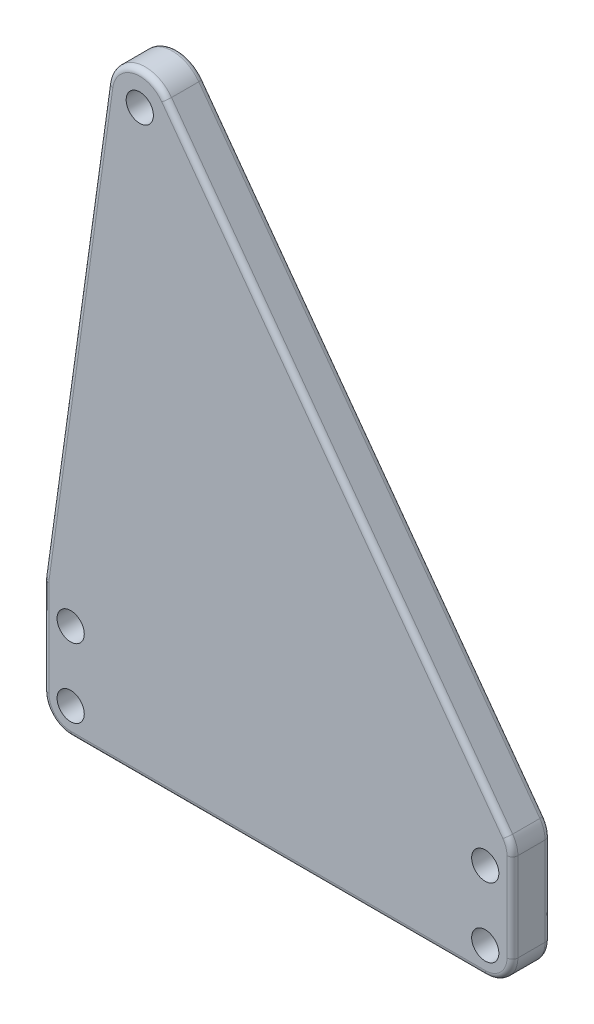
ISO-10303-21;
HEADER;
FILE_DESCRIPTION(('STEP AP214'),'2;1');
FILE_NAME('part.step','',(''),(''),'','','');
FILE_SCHEMA(('AUTOMOTIVE_DESIGN { 1 0 10303 214 1 1 1 1 }'));
ENDSEC;
DATA;
#1=APPLICATION_CONTEXT('core data for automotive mechanical design processes');
#2=APPLICATION_PROTOCOL_DEFINITION('international standard','automotive_design',2000,#1);
#3=PRODUCT_CONTEXT('',#1,'mechanical');
#4=PRODUCT('Part','Part','',(#3));
#5=PRODUCT_RELATED_PRODUCT_CATEGORY('part','',(#4));
#6=PRODUCT_DEFINITION_FORMATION('','',#4);
#7=PRODUCT_DEFINITION_CONTEXT('part definition',#1,'design');
#8=PRODUCT_DEFINITION('design','',#6,#7);
#9=PRODUCT_DEFINITION_SHAPE('','',#8);
#10=(LENGTH_UNIT() NAMED_UNIT(*) SI_UNIT(.MILLI.,.METRE.));
#11=(NAMED_UNIT(*) PLANE_ANGLE_UNIT() SI_UNIT($,.RADIAN.));
#12=(NAMED_UNIT(*) SI_UNIT($,.STERADIAN.) SOLID_ANGLE_UNIT());
#13=UNCERTAINTY_MEASURE_WITH_UNIT(LENGTH_MEASURE(1.E-05),#10,'distance_accuracy_value','');
#14=(GEOMETRIC_REPRESENTATION_CONTEXT(3) GLOBAL_UNCERTAINTY_ASSIGNED_CONTEXT((#13)) GLOBAL_UNIT_ASSIGNED_CONTEXT((#10,
#11,#12)) REPRESENTATION_CONTEXT('',''));
#15=CARTESIAN_POINT('',(0.,0.,0.));
#16=DIRECTION('',(0.,0.,1.));
#17=DIRECTION('',(1.,0.,0.));
#18=AXIS2_PLACEMENT_3D('',#15,#16,#17);
#19=CARTESIAN_POINT('',(4.84674686973694,3.5368127997811,7.));
#20=DIRECTION('',(-0.807791144956154,-0.589468799963515,0.));
#21=DIRECTION('',(0.589468799963515,-0.807791144956154,0.));
#22=AXIS2_PLACEMENT_3D('',#19,#20,#21);
#23=PLANE('',#22);
#24=DIRECTION('',(0.,0.,-1.));
#25=VECTOR('',#24,1.);
#26=CARTESIAN_POINT('',(67.5389557247808,-82.3747929950984,0.));
#27=LINE('',#26,#25);
#28=CARTESIAN_POINT('',(67.5389557247808,-82.3747929950984,6.));
#29=VERTEX_POINT('',#28);
#30=CARTESIAN_POINT('',(67.5389557247808,-82.3747929950984,1.));
#31=VERTEX_POINT('',#30);
#32=EDGE_CURVE('E399',#29,#31,#27,.T.);
#33=ORIENTED_EDGE('',*,*,#32,.T.);
#34=DIRECTION('',(-0.589468799963515,0.807791144956154,0.));
#35=VECTOR('',#34,1.);
#36=CARTESIAN_POINT('',(4.84674686973694,3.5368127997811,1.));
#37=LINE('',#36,#35);
#38=CARTESIAN_POINT('',(4.84674686973693,3.5368127997811,1.));
#39=VERTEX_POINT('',#38);
#40=EDGE_CURVE('E265',#31,#39,#37,.T.);
#41=ORIENTED_EDGE('',*,*,#40,.T.);
#42=DIRECTION('',(0.,0.,-1.));
#43=VECTOR('',#42,1.);
#44=CARTESIAN_POINT('',(4.84674686973693,3.5368127997811,7.));
#45=LINE('',#44,#43);
#46=CARTESIAN_POINT('',(4.84674686973693,3.5368127997811,6.));
#47=VERTEX_POINT('',#46);
#48=EDGE_CURVE('E459',#47,#39,#45,.T.);
#49=ORIENTED_EDGE('',*,*,#48,.F.);
#50=DIRECTION('',(-0.589468799963515,0.807791144956154,0.));
#51=VECTOR('',#50,1.);
#52=CARTESIAN_POINT('',(67.5389557247808,-82.3747929950984,6.));
#53=LINE('',#52,#51);
#54=EDGE_CURVE('E262',#47,#29,#53,.F.);
#55=ORIENTED_EDGE('',*,*,#54,.T.);
#56=EDGE_LOOP('',(#33,#41,#49,#55));
#57=FACE_BOUND('',#56,.T.);
#58=ADVANCED_FACE('F43',(#57),#23,.F.);
#59=CARTESIAN_POINT('',(0.,0.,7.));
#60=DIRECTION('',(0.,0.,-1.));
#61=DIRECTION('',(-1.,0.,0.));
#62=AXIS2_PLACEMENT_3D('',#59,#60,#61);
#63=CYLINDRICAL_SURFACE('',#62,6.);
#64=ORIENTED_EDGE('',*,*,#48,.T.);
#65=CARTESIAN_POINT('',(0.,0.,1.));
#66=DIRECTION('',(0.,0.,1.));
#67=DIRECTION('',(1.,0.,0.));
#68=AXIS2_PLACEMENT_3D('',#65,#66,#67);
#69=CIRCLE('',#68,6.);
#70=CARTESIAN_POINT('',(-5.94277579639863,0.826689684064445,1.));
#71=VERTEX_POINT('',#70);
#72=EDGE_CURVE('E271',#39,#71,#69,.T.);
#73=ORIENTED_EDGE('',*,*,#72,.T.);
#74=DIRECTION('',(0.,0.,-1.));
#75=VECTOR('',#74,1.);
#76=CARTESIAN_POINT('',(-5.94277579639863,0.826689684064445,7.));
#77=LINE('',#76,#75);
#78=CARTESIAN_POINT('',(-5.94277579639863,0.826689684064445,6.));
#79=VERTEX_POINT('',#78);
#80=EDGE_CURVE('E465',#79,#71,#77,.T.);
#81=ORIENTED_EDGE('',*,*,#80,.F.);
#82=CARTESIAN_POINT('',(0.,0.,6.));
#83=DIRECTION('',(0.,0.,1.));
#84=DIRECTION('',(1.,0.,0.));
#85=AXIS2_PLACEMENT_3D('',#82,#83,#84);
#86=CIRCLE('',#85,6.);
#87=EDGE_CURVE('E268',#79,#47,#86,.F.);
#88=ORIENTED_EDGE('',*,*,#87,.T.);
#89=EDGE_LOOP('',(#64,#73,#81,#88));
#90=FACE_BOUND('',#89,.T.);
#91=ADVANCED_FACE('F538',(#90),#63,.T.);
#92=CARTESIAN_POINT('',(-5.94277579639863,0.826689684064445,7.));
#93=DIRECTION('',(-0.990462632733106,0.137781614010741,0.));
#94=DIRECTION('',(-0.137781614010741,-0.990462632733106,0.));
#95=AXIS2_PLACEMENT_3D('',#92,#93,#94);
#96=PLANE('',#95);
#97=ORIENTED_EDGE('',*,*,#80,.T.);
#98=DIRECTION('',(0.137781614010741,0.990462632733106,0.));
#99=VECTOR('',#98,1.);
#100=CARTESIAN_POINT('',(-17.6523131636655,-83.3489769470851,1.));
#101=LINE('',#100,#99);
#102=CARTESIAN_POINT('',(-17.6523131636655,-83.3489769470851,1.));
#103=VERTEX_POINT('',#102);
#104=EDGE_CURVE('E11',#71,#103,#101,.F.);
#105=ORIENTED_EDGE('',*,*,#104,.T.);
#106=DIRECTION('',(0.,0.,-1.));
#107=VECTOR('',#106,1.);
#108=CARTESIAN_POINT('',(-17.6523131636655,-83.3489769470851,7.));
#109=LINE('',#108,#107);
#110=CARTESIAN_POINT('',(-17.6523131636655,-83.3489769470851,6.));
#111=VERTEX_POINT('',#110);
#112=EDGE_CURVE('E406',#103,#111,#109,.F.);
#113=ORIENTED_EDGE('',*,*,#112,.T.);
#114=DIRECTION('',(0.137781614010741,0.990462632733106,0.));
#115=VECTOR('',#114,1.);
#116=CARTESIAN_POINT('',(-5.94277579639863,0.826689684064445,6.));
#117=LINE('',#116,#115);
#118=EDGE_CURVE('E53',#111,#79,#117,.T.);
#119=ORIENTED_EDGE('',*,*,#118,.T.);
#120=EDGE_LOOP('',(#97,#105,#113,#119));
#121=FACE_BOUND('',#120,.T.);
#122=ADVANCED_FACE('F544',(#121),#96,.T.);
#123=CARTESIAN_POINT('',(-17.7,0.,7.));
#124=DIRECTION('',(1.,0.,0.));
#125=DIRECTION('',(0.,1.,0.));
#126=AXIS2_PLACEMENT_3D('',#123,#124,#125);
#127=PLANE('',#126);
#128=DIRECTION('',(0.,0.,-1.));
#129=VECTOR('',#128,1.);
#130=CARTESIAN_POINT('',(-17.7,-84.0378850171388,0.));
#131=LINE('',#130,#129);
#132=CARTESIAN_POINT('',(-17.7,-84.0378850171388,6.));
#133=VERTEX_POINT('',#132);
#134=CARTESIAN_POINT('',(-17.7,-84.0378850171388,1.));
#135=VERTEX_POINT('',#134);
#136=EDGE_CURVE('E450',#133,#135,#131,.T.);
#137=ORIENTED_EDGE('',*,*,#136,.T.);
#138=DIRECTION('',(0.,-1.,0.));
#139=VECTOR('',#138,1.);
#140=CARTESIAN_POINT('',(-17.7,0.,1.));
#141=LINE('',#140,#139);
#142=CARTESIAN_POINT('',(-17.7,-101.6,1.));
#143=VERTEX_POINT('',#142);
#144=EDGE_CURVE('E229',#135,#143,#141,.T.);
#145=ORIENTED_EDGE('',*,*,#144,.T.);
#146=DIRECTION('',(0.,0.,-1.));
#147=VECTOR('',#146,1.);
#148=CARTESIAN_POINT('',(-17.7,-101.6,7.));
#149=LINE('',#148,#147);
#150=CARTESIAN_POINT('',(-17.7,-101.6,6.));
#151=VERTEX_POINT('',#150);
#152=EDGE_CURVE('E455',#143,#151,#149,.F.);
#153=ORIENTED_EDGE('',*,*,#152,.T.);
#154=DIRECTION('',(0.,-1.,0.));
#155=VECTOR('',#154,1.);
#156=CARTESIAN_POINT('',(-17.7,-84.0378850171388,6.));
#157=LINE('',#156,#155);
#158=EDGE_CURVE('E226',#151,#133,#157,.F.);
#159=ORIENTED_EDGE('',*,*,#158,.T.);
#160=EDGE_LOOP('',(#137,#145,#153,#159));
#161=FACE_BOUND('',#160,.T.);
#162=ADVANCED_FACE('F452',(#161),#127,.F.);
#163=CARTESIAN_POINT('',(0.,-106.6,7.));
#164=DIRECTION('',(0.,1.,0.));
#165=DIRECTION('',(0.,0.,1.));
#166=AXIS2_PLACEMENT_3D('',#163,#164,#165);
#167=PLANE('',#166);
#168=DIRECTION('',(0.,0.,-1.));
#169=VECTOR('',#168,1.);
#170=CARTESIAN_POINT('',(-12.7,-106.6,7.));
#171=LINE('',#170,#169);
#172=CARTESIAN_POINT('',(-12.7,-106.6,6.));
#173=VERTEX_POINT('',#172);
#174=CARTESIAN_POINT('',(-12.7,-106.6,1.));
#175=VERTEX_POINT('',#174);
#176=EDGE_CURVE('E403',#173,#175,#171,.T.);
#177=ORIENTED_EDGE('',*,*,#176,.T.);
#178=DIRECTION('',(1.,0.,0.));
#179=VECTOR('',#178,1.);
#180=CARTESIAN_POINT('',(0.,-106.6,1.));
#181=LINE('',#180,#179);
#182=CARTESIAN_POINT('',(63.5,-106.6,1.));
#183=VERTEX_POINT('',#182);
#184=EDGE_CURVE('E241',#175,#183,#181,.T.);
#185=ORIENTED_EDGE('',*,*,#184,.T.);
#186=DIRECTION('',(0.,0.,-1.));
#187=VECTOR('',#186,1.);
#188=CARTESIAN_POINT('',(63.5,-106.6,7.));
#189=LINE('',#188,#187);
#190=CARTESIAN_POINT('',(63.5,-106.6,6.));
#191=VERTEX_POINT('',#190);
#192=EDGE_CURVE('E206',#183,#191,#189,.F.);
#193=ORIENTED_EDGE('',*,*,#192,.T.);
#194=DIRECTION('',(1.,0.,0.));
#195=VECTOR('',#194,1.);
#196=CARTESIAN_POINT('',(-12.7,-106.6,6.));
#197=LINE('',#196,#195);
#198=EDGE_CURVE('E238',#191,#173,#197,.F.);
#199=ORIENTED_EDGE('',*,*,#198,.T.);
#200=EDGE_LOOP('',(#177,#185,#193,#199));
#201=FACE_BOUND('',#200,.T.);
#202=ADVANCED_FACE('F709',(#201),#167,.F.);
#203=CARTESIAN_POINT('',(-12.7,-88.9,7.));
#204=DIRECTION('',(0.,0.,-1.));
#205=DIRECTION('',(-1.,0.,0.));
#206=AXIS2_PLACEMENT_3D('',#203,#204,#205);
#207=CYLINDRICAL_SURFACE('',#206,2.5);
#208=CARTESIAN_POINT('',(-12.7,-88.9,7.));
#209=DIRECTION('',(0.,0.,1.));
#210=DIRECTION('',(1.,0.,0.));
#211=AXIS2_PLACEMENT_3D('',#208,#209,#210);
#212=CIRCLE('',#211,2.5);
#213=CARTESIAN_POINT('',(-10.2,-88.9,7.));
#214=VERTEX_POINT('',#213);
#215=EDGE_CURVE('E493',#214,#214,#212,.T.);
#216=ORIENTED_EDGE('',*,*,#215,.T.);
#217=EDGE_LOOP('',(#216));
#218=FACE_BOUND('',#217,.T.);
#219=CARTESIAN_POINT('',(-12.7,-88.9,0.));
#220=DIRECTION('',(0.,0.,1.));
#221=DIRECTION('',(1.,0.,0.));
#222=AXIS2_PLACEMENT_3D('',#219,#220,#221);
#223=CIRCLE('',#222,2.5);
#224=CARTESIAN_POINT('',(-10.2,-88.9,0.));
#225=VERTEX_POINT('',#224);
#226=EDGE_CURVE('E475',#225,#225,#223,.T.);
#227=ORIENTED_EDGE('',*,*,#226,.F.);
#228=EDGE_LOOP('',(#227));
#229=FACE_BOUND('',#228,.T.);
#230=ADVANCED_FACE('F714',(#218,#229),#207,.F.);
#231=CARTESIAN_POINT('',(-12.7,-101.6,7.));
#232=DIRECTION('',(0.,0.,-1.));
#233=DIRECTION('',(-1.,0.,0.));
#234=AXIS2_PLACEMENT_3D('',#231,#232,#233);
#235=CYLINDRICAL_SURFACE('',#234,2.5);
#236=CARTESIAN_POINT('',(-12.7,-101.6,7.));
#237=DIRECTION('',(0.,0.,1.));
#238=DIRECTION('',(1.,0.,0.));
#239=AXIS2_PLACEMENT_3D('',#236,#237,#238);
#240=CIRCLE('',#239,2.5);
#241=CARTESIAN_POINT('',(-10.2,-101.6,7.));
#242=VERTEX_POINT('',#241);
#243=EDGE_CURVE('E497',#242,#242,#240,.T.);
#244=ORIENTED_EDGE('',*,*,#243,.T.);
#245=EDGE_LOOP('',(#244));
#246=FACE_BOUND('',#245,.T.);
#247=CARTESIAN_POINT('',(-12.7,-101.6,0.));
#248=DIRECTION('',(0.,0.,1.));
#249=DIRECTION('',(1.,0.,0.));
#250=AXIS2_PLACEMENT_3D('',#247,#248,#249);
#251=CIRCLE('',#250,2.5);
#252=CARTESIAN_POINT('',(-10.2,-101.6,0.));
#253=VERTEX_POINT('',#252);
#254=EDGE_CURVE('E479',#253,#253,#251,.T.);
#255=ORIENTED_EDGE('',*,*,#254,.F.);
#256=EDGE_LOOP('',(#255));
#257=FACE_BOUND('',#256,.T.);
#258=ADVANCED_FACE('F764',(#246,#257),#235,.F.);
#259=CARTESIAN_POINT('',(63.5,-88.9,7.));
#260=DIRECTION('',(0.,0.,-1.));
#261=DIRECTION('',(-1.,0.,0.));
#262=AXIS2_PLACEMENT_3D('',#259,#260,#261);
#263=CYLINDRICAL_SURFACE('',#262,2.50000000000001);
#264=CARTESIAN_POINT('',(63.5,-88.9,7.));
#265=DIRECTION('',(0.,0.,1.));
#266=DIRECTION('',(1.,0.,0.));
#267=AXIS2_PLACEMENT_3D('',#264,#265,#266);
#268=CIRCLE('',#267,2.50000000000001);
#269=CARTESIAN_POINT('',(66.,-88.9,7.));
#270=VERTEX_POINT('',#269);
#271=EDGE_CURVE('E501',#270,#270,#268,.T.);
#272=ORIENTED_EDGE('',*,*,#271,.T.);
#273=EDGE_LOOP('',(#272));
#274=FACE_BOUND('',#273,.T.);
#275=CARTESIAN_POINT('',(63.5,-88.9,0.));
#276=DIRECTION('',(0.,0.,1.));
#277=DIRECTION('',(1.,0.,0.));
#278=AXIS2_PLACEMENT_3D('',#275,#276,#277);
#279=CIRCLE('',#278,2.50000000000001);
#280=CARTESIAN_POINT('',(66.,-88.9,0.));
#281=VERTEX_POINT('',#280);
#282=EDGE_CURVE('E483',#281,#281,#279,.T.);
#283=ORIENTED_EDGE('',*,*,#282,.F.);
#284=EDGE_LOOP('',(#283));
#285=FACE_BOUND('',#284,.T.);
#286=ADVANCED_FACE('F755',(#274,#285),#263,.F.);
#287=CARTESIAN_POINT('',(63.5,-101.6,7.));
#288=DIRECTION('',(0.,0.,-1.));
#289=DIRECTION('',(-1.,0.,0.));
#290=AXIS2_PLACEMENT_3D('',#287,#288,#289);
#291=CYLINDRICAL_SURFACE('',#290,2.50000000000001);
#292=CARTESIAN_POINT('',(63.5,-101.6,7.));
#293=DIRECTION('',(0.,0.,1.));
#294=DIRECTION('',(1.,0.,0.));
#295=AXIS2_PLACEMENT_3D('',#292,#293,#294);
#296=CIRCLE('',#295,2.50000000000001);
#297=CARTESIAN_POINT('',(66.,-101.6,7.));
#298=VERTEX_POINT('',#297);
#299=EDGE_CURVE('E474',#298,#298,#296,.T.);
#300=ORIENTED_EDGE('',*,*,#299,.T.);
#301=EDGE_LOOP('',(#300));
#302=FACE_BOUND('',#301,.T.);
#303=CARTESIAN_POINT('',(63.5,-101.6,0.));
#304=DIRECTION('',(0.,0.,1.));
#305=DIRECTION('',(1.,0.,0.));
#306=AXIS2_PLACEMENT_3D('',#303,#304,#305);
#307=CIRCLE('',#306,2.50000000000001);
#308=CARTESIAN_POINT('',(66.,-101.6,0.));
#309=VERTEX_POINT('',#308);
#310=EDGE_CURVE('E337',#309,#309,#307,.T.);
#311=ORIENTED_EDGE('',*,*,#310,.F.);
#312=EDGE_LOOP('',(#311));
#313=FACE_BOUND('',#312,.T.);
#314=ADVANCED_FACE('F509',(#302,#313),#291,.F.);
#315=CARTESIAN_POINT('',(68.5,0.,7.));
#316=DIRECTION('',(1.,0.,0.));
#317=DIRECTION('',(0.,0.,-1.));
#318=AXIS2_PLACEMENT_3D('',#315,#316,#317);
#319=PLANE('',#318);
#320=DIRECTION('',(0.,0.,-1.));
#321=VECTOR('',#320,1.);
#322=CARTESIAN_POINT('',(68.5,-101.6,0.));
#323=LINE('',#322,#321);
#324=CARTESIAN_POINT('',(68.5,-101.6,6.));
#325=VERTEX_POINT('',#324);
#326=CARTESIAN_POINT('',(68.5,-101.6,1.));
#327=VERTEX_POINT('',#326);
#328=EDGE_CURVE('E389',#325,#327,#323,.T.);
#329=ORIENTED_EDGE('',*,*,#328,.T.);
#330=DIRECTION('',(0.,-1.,0.));
#331=VECTOR('',#330,1.);
#332=CARTESIAN_POINT('',(68.5,-85.322136994916,1.));
#333=LINE('',#332,#331);
#334=CARTESIAN_POINT('',(68.5,-85.322136994916,1.));
#335=VERTEX_POINT('',#334);
#336=EDGE_CURVE('E253',#327,#335,#333,.F.);
#337=ORIENTED_EDGE('',*,*,#336,.T.);
#338=DIRECTION('',(0.,0.,-1.));
#339=VECTOR('',#338,1.);
#340=CARTESIAN_POINT('',(68.5,-85.322136994916,7.));
#341=LINE('',#340,#339);
#342=CARTESIAN_POINT('',(68.5,-85.322136994916,6.));
#343=VERTEX_POINT('',#342);
#344=EDGE_CURVE('E392',#335,#343,#341,.F.);
#345=ORIENTED_EDGE('',*,*,#344,.T.);
#346=DIRECTION('',(0.,-1.,0.));
#347=VECTOR('',#346,1.);
#348=CARTESIAN_POINT('',(68.5,0.,6.));
#349=LINE('',#348,#347);
#350=EDGE_CURVE('E250',#343,#325,#349,.T.);
#351=ORIENTED_EDGE('',*,*,#350,.T.);
#352=EDGE_LOOP('',(#329,#337,#345,#351));
#353=FACE_BOUND('',#352,.T.);
#354=ADVANCED_FACE('F388',(#353),#319,.T.);
#355=CARTESIAN_POINT('',(0.,0.,7.));
#356=DIRECTION('',(0.,0.,-1.));
#357=DIRECTION('',(-1.,0.,0.));
#358=AXIS2_PLACEMENT_3D('',#355,#356,#357);
#359=CYLINDRICAL_SURFACE('',#358,2.5);
#360=CARTESIAN_POINT('',(0.,0.,7.));
#361=DIRECTION('',(0.,0.,1.));
#362=DIRECTION('',(1.,0.,0.));
#363=AXIS2_PLACEMENT_3D('',#360,#361,#362);
#364=CIRCLE('',#363,2.5);
#365=CARTESIAN_POINT('',(2.5,0.,7.));
#366=VERTEX_POINT('',#365);
#367=EDGE_CURVE('E469',#366,#366,#364,.T.);
#368=ORIENTED_EDGE('',*,*,#367,.T.);
#369=EDGE_LOOP('',(#368));
#370=FACE_BOUND('',#369,.T.);
#371=CARTESIAN_POINT('',(0.,0.,0.));
#372=DIRECTION('',(0.,0.,1.));
#373=DIRECTION('',(1.,0.,0.));
#374=AXIS2_PLACEMENT_3D('',#371,#372,#373);
#375=CIRCLE('',#374,2.5);
#376=CARTESIAN_POINT('',(2.5,0.,0.));
#377=VERTEX_POINT('',#376);
#378=EDGE_CURVE('E470',#377,#377,#375,.T.);
#379=ORIENTED_EDGE('',*,*,#378,.F.);
#380=EDGE_LOOP('',(#379));
#381=FACE_BOUND('',#380,.T.);
#382=ADVANCED_FACE('F515',(#370,#381),#359,.F.);
#383=CARTESIAN_POINT('',(0.,0.,7.));
#384=DIRECTION('',(0.,0.,1.));
#385=DIRECTION('',(1.,0.,0.));
#386=AXIS2_PLACEMENT_3D('',#383,#384,#385);
#387=PLANE('',#386);
#388=DIRECTION('',(0.137781614010741,0.990462632733106,0.));
#389=VECTOR('',#388,1.);
#390=CARTESIAN_POINT('',(-4.95231316366553,0.688908070053704,7.));
#391=LINE('',#390,#389);
#392=CARTESIAN_POINT('',(-4.95231316366553,0.688908070053704,7.));
#393=VERTEX_POINT('',#392);
#394=CARTESIAN_POINT('',(-16.6618505309324,-83.4867585610958,7.));
#395=VERTEX_POINT('',#394);
#396=EDGE_CURVE('E274',#393,#395,#391,.F.);
#397=ORIENTED_EDGE('',*,*,#396,.T.);
#398=CARTESIAN_POINT('',(-12.7,-84.0378850171388,7.));
#399=DIRECTION('',(0.,0.,1.));
#400=DIRECTION('',(1.,0.,0.));
#401=AXIS2_PLACEMENT_3D('',#398,#399,#400);
#402=CIRCLE('',#401,4.);
#403=CARTESIAN_POINT('',(-16.7,-84.0378850171388,7.));
#404=VERTEX_POINT('',#403);
#405=EDGE_CURVE('E300',#395,#404,#402,.T.);
#406=ORIENTED_EDGE('',*,*,#405,.T.);
#407=DIRECTION('',(0.,-1.,0.));
#408=VECTOR('',#407,1.);
#409=CARTESIAN_POINT('',(-16.7,-101.6,7.));
#410=LINE('',#409,#408);
#411=CARTESIAN_POINT('',(-16.7,-101.6,7.));
#412=VERTEX_POINT('',#411);
#413=EDGE_CURVE('E68',#404,#412,#410,.T.);
#414=ORIENTED_EDGE('',*,*,#413,.T.);
#415=CARTESIAN_POINT('',(-12.7,-101.6,7.));
#416=DIRECTION('',(0.,0.,1.));
#417=DIRECTION('',(1.,0.,0.));
#418=AXIS2_PLACEMENT_3D('',#415,#416,#417);
#419=CIRCLE('',#418,4.);
#420=CARTESIAN_POINT('',(-12.7,-105.6,7.));
#421=VERTEX_POINT('',#420);
#422=EDGE_CURVE('E295',#412,#421,#419,.T.);
#423=ORIENTED_EDGE('',*,*,#422,.T.);
#424=DIRECTION('',(1.,0.,0.));
#425=VECTOR('',#424,1.);
#426=CARTESIAN_POINT('',(63.5,-105.6,7.));
#427=LINE('',#426,#425);
#428=CARTESIAN_POINT('',(63.5,-105.6,7.));
#429=VERTEX_POINT('',#428);
#430=EDGE_CURVE('E292',#421,#429,#427,.T.);
#431=ORIENTED_EDGE('',*,*,#430,.T.);
#432=CARTESIAN_POINT('',(63.5,-101.6,7.));
#433=DIRECTION('',(0.,0.,1.));
#434=DIRECTION('',(1.,0.,0.));
#435=AXIS2_PLACEMENT_3D('',#432,#433,#434);
#436=CIRCLE('',#435,4.);
#437=CARTESIAN_POINT('',(67.5,-101.6,7.));
#438=VERTEX_POINT('',#437);
#439=EDGE_CURVE('E289',#429,#438,#436,.T.);
#440=ORIENTED_EDGE('',*,*,#439,.T.);
#441=DIRECTION('',(0.,-1.,0.));
#442=VECTOR('',#441,1.);
#443=CARTESIAN_POINT('',(67.5,0.,7.));
#444=LINE('',#443,#442);
#445=CARTESIAN_POINT('',(67.5,-85.322136994916,7.));
#446=VERTEX_POINT('',#445);
#447=EDGE_CURVE('E286',#438,#446,#444,.F.);
#448=ORIENTED_EDGE('',*,*,#447,.T.);
#449=CARTESIAN_POINT('',(63.5,-85.322136994916,7.));
#450=DIRECTION('',(0.,0.,1.));
#451=DIRECTION('',(1.,0.,0.));
#452=AXIS2_PLACEMENT_3D('',#449,#450,#451);
#453=CIRCLE('',#452,4.);
#454=CARTESIAN_POINT('',(66.7311645798246,-82.9642617950619,7.));
#455=VERTEX_POINT('',#454);
#456=EDGE_CURVE('E283',#446,#455,#453,.T.);
#457=ORIENTED_EDGE('',*,*,#456,.T.);
#458=DIRECTION('',(-0.589468799963515,0.807791144956154,0.));
#459=VECTOR('',#458,1.);
#460=CARTESIAN_POINT('',(4.03895572478078,2.94734399981759,7.));
#461=LINE('',#460,#459);
#462=CARTESIAN_POINT('',(4.03895572478077,2.94734399981758,7.));
#463=VERTEX_POINT('',#462);
#464=EDGE_CURVE('E280',#455,#463,#461,.T.);
#465=ORIENTED_EDGE('',*,*,#464,.T.);
#466=CARTESIAN_POINT('',(0.,0.,7.));
#467=DIRECTION('',(0.,0.,1.));
#468=DIRECTION('',(1.,0.,0.));
#469=AXIS2_PLACEMENT_3D('',#466,#467,#468);
#470=CIRCLE('',#469,5.);
#471=EDGE_CURVE('E277',#463,#393,#470,.T.);
#472=ORIENTED_EDGE('',*,*,#471,.T.);
#473=EDGE_LOOP('',(#397,#406,#414,#423,#431,#440,#448,#457,#465,#472));
#474=FACE_BOUND('',#473,.T.);
#475=ORIENTED_EDGE('',*,*,#299,.F.);
#476=EDGE_LOOP('',(#475));
#477=FACE_BOUND('',#476,.T.);
#478=ORIENTED_EDGE('',*,*,#271,.F.);
#479=EDGE_LOOP('',(#478));
#480=FACE_BOUND('',#479,.T.);
#481=ORIENTED_EDGE('',*,*,#243,.F.);
#482=EDGE_LOOP('',(#481));
#483=FACE_BOUND('',#482,.T.);
#484=ORIENTED_EDGE('',*,*,#215,.F.);
#485=EDGE_LOOP('',(#484));
#486=FACE_BOUND('',#485,.T.);
#487=ORIENTED_EDGE('',*,*,#367,.F.);
#488=EDGE_LOOP('',(#487));
#489=FACE_BOUND('',#488,.T.);
#490=ADVANCED_FACE('F512',(#474,#477,#480,#483,#486,#489),#387,.T.);
#491=CARTESIAN_POINT('',(0.,0.,0.));
#492=DIRECTION('',(0.,0.,1.));
#493=DIRECTION('',(1.,0.,0.));
#494=AXIS2_PLACEMENT_3D('',#491,#492,#493);
#495=PLANE('',#494);
#496=DIRECTION('',(0.,-1.,0.));
#497=VECTOR('',#496,1.);
#498=CARTESIAN_POINT('',(-16.7,0.,0.));
#499=LINE('',#498,#497);
#500=CARTESIAN_POINT('',(-16.7,-101.6,0.));
#501=VERTEX_POINT('',#500);
#502=CARTESIAN_POINT('',(-16.7,-84.0378850171388,0.));
#503=VERTEX_POINT('',#502);
#504=EDGE_CURVE('E211',#501,#503,#499,.F.);
#505=ORIENTED_EDGE('',*,*,#504,.T.);
#506=CARTESIAN_POINT('',(-12.7,-84.0378850171388,0.));
#507=DIRECTION('',(0.,0.,1.));
#508=DIRECTION('',(1.,0.,0.));
#509=AXIS2_PLACEMENT_3D('',#506,#507,#508);
#510=CIRCLE('',#509,4.);
#511=CARTESIAN_POINT('',(-16.6618505309324,-83.4867585610958,0.));
#512=VERTEX_POINT('',#511);
#513=EDGE_CURVE('E189',#503,#512,#510,.F.);
#514=ORIENTED_EDGE('',*,*,#513,.T.);
#515=DIRECTION('',(0.137781614010741,0.990462632733106,0.));
#516=VECTOR('',#515,1.);
#517=CARTESIAN_POINT('',(-4.95231316366553,0.688908070053704,0.));
#518=LINE('',#517,#516);
#519=CARTESIAN_POINT('',(-4.95231316366553,0.688908070053704,0.));
#520=VERTEX_POINT('',#519);
#521=EDGE_CURVE('E198',#512,#520,#518,.T.);
#522=ORIENTED_EDGE('',*,*,#521,.T.);
#523=CARTESIAN_POINT('',(0.,0.,0.));
#524=DIRECTION('',(0.,0.,1.));
#525=DIRECTION('',(1.,0.,0.));
#526=AXIS2_PLACEMENT_3D('',#523,#524,#525);
#527=CIRCLE('',#526,5.);
#528=CARTESIAN_POINT('',(4.03895572478077,2.94734399981757,0.));
#529=VERTEX_POINT('',#528);
#530=EDGE_CURVE('E205',#520,#529,#527,.F.);
#531=ORIENTED_EDGE('',*,*,#530,.T.);
#532=DIRECTION('',(-0.589468799963515,0.807791144956154,0.));
#533=VECTOR('',#532,1.);
#534=CARTESIAN_POINT('',(4.03895572478078,2.94734399981759,0.));
#535=LINE('',#534,#533);
#536=CARTESIAN_POINT('',(66.7311645798246,-82.9642617950619,0.));
#537=VERTEX_POINT('',#536);
#538=EDGE_CURVE('E417',#529,#537,#535,.F.);
#539=ORIENTED_EDGE('',*,*,#538,.T.);
#540=CARTESIAN_POINT('',(63.5,-85.322136994916,0.));
#541=DIRECTION('',(0.,0.,1.));
#542=DIRECTION('',(1.,0.,0.));
#543=AXIS2_PLACEMENT_3D('',#540,#541,#542);
#544=CIRCLE('',#543,4.);
#545=CARTESIAN_POINT('',(67.5,-85.322136994916,0.));
#546=VERTEX_POINT('',#545);
#547=EDGE_CURVE('E420',#537,#546,#544,.F.);
#548=ORIENTED_EDGE('',*,*,#547,.T.);
#549=DIRECTION('',(0.,-1.,0.));
#550=VECTOR('',#549,1.);
#551=CARTESIAN_POINT('',(67.5,-101.6,0.));
#552=LINE('',#551,#550);
#553=CARTESIAN_POINT('',(67.5,-101.6,0.));
#554=VERTEX_POINT('',#553);
#555=EDGE_CURVE('E423',#546,#554,#552,.T.);
#556=ORIENTED_EDGE('',*,*,#555,.T.);
#557=CARTESIAN_POINT('',(63.5,-101.6,0.));
#558=DIRECTION('',(0.,0.,1.));
#559=DIRECTION('',(1.,0.,0.));
#560=AXIS2_PLACEMENT_3D('',#557,#558,#559);
#561=CIRCLE('',#560,4.);
#562=CARTESIAN_POINT('',(63.5,-105.6,0.));
#563=VERTEX_POINT('',#562);
#564=EDGE_CURVE('E426',#554,#563,#561,.F.);
#565=ORIENTED_EDGE('',*,*,#564,.T.);
#566=DIRECTION('',(1.,0.,0.));
#567=VECTOR('',#566,1.);
#568=CARTESIAN_POINT('',(0.,-105.6,0.));
#569=LINE('',#568,#567);
#570=CARTESIAN_POINT('',(-12.7,-105.6,0.));
#571=VERTEX_POINT('',#570);
#572=EDGE_CURVE('E429',#563,#571,#569,.F.);
#573=ORIENTED_EDGE('',*,*,#572,.T.);
#574=CARTESIAN_POINT('',(-12.7,-101.6,0.));
#575=DIRECTION('',(0.,0.,1.));
#576=DIRECTION('',(1.,0.,0.));
#577=AXIS2_PLACEMENT_3D('',#574,#575,#576);
#578=CIRCLE('',#577,4.);
#579=EDGE_CURVE('E220',#571,#501,#578,.F.);
#580=ORIENTED_EDGE('',*,*,#579,.T.);
#581=EDGE_LOOP('',(#505,#514,#522,#531,#539,#548,#556,#565,#573,#580));
#582=FACE_BOUND('',#581,.T.);
#583=ORIENTED_EDGE('',*,*,#310,.T.);
#584=EDGE_LOOP('',(#583));
#585=FACE_BOUND('',#584,.T.);
#586=ORIENTED_EDGE('',*,*,#282,.T.);
#587=EDGE_LOOP('',(#586));
#588=FACE_BOUND('',#587,.T.);
#589=ORIENTED_EDGE('',*,*,#254,.T.);
#590=EDGE_LOOP('',(#589));
#591=FACE_BOUND('',#590,.T.);
#592=ORIENTED_EDGE('',*,*,#226,.T.);
#593=EDGE_LOOP('',(#592));
#594=FACE_BOUND('',#593,.T.);
#595=ORIENTED_EDGE('',*,*,#378,.T.);
#596=EDGE_LOOP('',(#595));
#597=FACE_BOUND('',#596,.T.);
#598=ADVANCED_FACE('F208',(#582,#585,#588,#591,#594,#597),#495,.F.);
#599=CARTESIAN_POINT('',(-12.7,-84.0378850171388,7.));
#600=DIRECTION('',(0.,0.,1.));
#601=DIRECTION('',(1.,0.,0.));
#602=AXIS2_PLACEMENT_3D('',#599,#600,#601);
#603=CYLINDRICAL_SURFACE('',#602,5.);
#604=ORIENTED_EDGE('',*,*,#112,.F.);
#605=CARTESIAN_POINT('',(-12.7,-84.0378850171388,1.));
#606=DIRECTION('',(0.,0.,1.));
#607=DIRECTION('',(1.,0.,0.));
#608=AXIS2_PLACEMENT_3D('',#605,#606,#607);
#609=CIRCLE('',#608,5.);
#610=EDGE_CURVE('E191',#103,#135,#609,.T.);
#611=ORIENTED_EDGE('',*,*,#610,.T.);
#612=ORIENTED_EDGE('',*,*,#136,.F.);
#613=CARTESIAN_POINT('',(-12.7,-84.0378850171388,6.));
#614=DIRECTION('',(0.,0.,1.));
#615=DIRECTION('',(1.,0.,0.));
#616=AXIS2_PLACEMENT_3D('',#613,#614,#615);
#617=CIRCLE('',#616,5.);
#618=EDGE_CURVE('E214',#133,#111,#617,.F.);
#619=ORIENTED_EDGE('',*,*,#618,.T.);
#620=EDGE_LOOP('',(#604,#611,#612,#619));
#621=FACE_BOUND('',#620,.T.);
#622=ADVANCED_FACE('F449',(#621),#603,.T.);
#623=CARTESIAN_POINT('',(63.5,-85.322136994916,7.));
#624=DIRECTION('',(0.,0.,1.));
#625=DIRECTION('',(1.,0.,0.));
#626=AXIS2_PLACEMENT_3D('',#623,#624,#625);
#627=CYLINDRICAL_SURFACE('',#626,5.);
#628=ORIENTED_EDGE('',*,*,#344,.F.);
#629=CARTESIAN_POINT('',(63.5,-85.322136994916,1.));
#630=DIRECTION('',(0.,0.,1.));
#631=DIRECTION('',(1.,0.,0.));
#632=AXIS2_PLACEMENT_3D('',#629,#630,#631);
#633=CIRCLE('',#632,5.);
#634=EDGE_CURVE('E259',#335,#31,#633,.T.);
#635=ORIENTED_EDGE('',*,*,#634,.T.);
#636=ORIENTED_EDGE('',*,*,#32,.F.);
#637=CARTESIAN_POINT('',(63.5,-85.322136994916,6.));
#638=DIRECTION('',(0.,0.,1.));
#639=DIRECTION('',(1.,0.,0.));
#640=AXIS2_PLACEMENT_3D('',#637,#638,#639);
#641=CIRCLE('',#640,5.);
#642=EDGE_CURVE('E256',#29,#343,#641,.F.);
#643=ORIENTED_EDGE('',*,*,#642,.T.);
#644=EDGE_LOOP('',(#628,#635,#636,#643));
#645=FACE_BOUND('',#644,.T.);
#646=ADVANCED_FACE('F535',(#645),#627,.T.);
#647=CARTESIAN_POINT('',(63.5,-101.6,7.));
#648=DIRECTION('',(0.,0.,1.));
#649=DIRECTION('',(1.,0.,0.));
#650=AXIS2_PLACEMENT_3D('',#647,#648,#649);
#651=CYLINDRICAL_SURFACE('',#650,5.);
#652=ORIENTED_EDGE('',*,*,#192,.F.);
#653=CARTESIAN_POINT('',(63.5,-101.6,1.));
#654=DIRECTION('',(0.,0.,1.));
#655=DIRECTION('',(1.,0.,0.));
#656=AXIS2_PLACEMENT_3D('',#653,#654,#655);
#657=CIRCLE('',#656,5.);
#658=EDGE_CURVE('E247',#183,#327,#657,.T.);
#659=ORIENTED_EDGE('',*,*,#658,.T.);
#660=ORIENTED_EDGE('',*,*,#328,.F.);
#661=CARTESIAN_POINT('',(63.5,-101.6,6.));
#662=DIRECTION('',(0.,0.,1.));
#663=DIRECTION('',(1.,0.,0.));
#664=AXIS2_PLACEMENT_3D('',#661,#662,#663);
#665=CIRCLE('',#664,5.);
#666=EDGE_CURVE('E244',#325,#191,#665,.F.);
#667=ORIENTED_EDGE('',*,*,#666,.T.);
#668=EDGE_LOOP('',(#652,#659,#660,#667));
#669=FACE_BOUND('',#668,.T.);
#670=ADVANCED_FACE('F395',(#669),#651,.T.);
#671=CARTESIAN_POINT('',(-12.7,-101.6,7.));
#672=DIRECTION('',(0.,0.,-1.));
#673=DIRECTION('',(-1.,0.,0.));
#674=AXIS2_PLACEMENT_3D('',#671,#672,#673);
#675=CYLINDRICAL_SURFACE('',#674,5.);
#676=ORIENTED_EDGE('',*,*,#152,.F.);
#677=CARTESIAN_POINT('',(-12.7,-101.6,1.));
#678=DIRECTION('',(0.,0.,1.));
#679=DIRECTION('',(1.,0.,0.));
#680=AXIS2_PLACEMENT_3D('',#677,#678,#679);
#681=CIRCLE('',#680,5.);
#682=EDGE_CURVE('E235',#143,#175,#681,.T.);
#683=ORIENTED_EDGE('',*,*,#682,.T.);
#684=ORIENTED_EDGE('',*,*,#176,.F.);
#685=CARTESIAN_POINT('',(-12.7,-101.6,6.));
#686=DIRECTION('',(0.,0.,1.));
#687=DIRECTION('',(1.,0.,0.));
#688=AXIS2_PLACEMENT_3D('',#685,#686,#687);
#689=CIRCLE('',#688,5.);
#690=EDGE_CURVE('E232',#173,#151,#689,.F.);
#691=ORIENTED_EDGE('',*,*,#690,.T.);
#692=EDGE_LOOP('',(#676,#683,#684,#691));
#693=FACE_BOUND('',#692,.T.);
#694=ADVANCED_FACE('F554',(#693),#675,.T.);
#695=CARTESIAN_POINT('',(67.5,0.,1.));
#696=DIRECTION('',(0.,1.,0.));
#697=DIRECTION('',(0.,0.,1.));
#698=AXIS2_PLACEMENT_3D('',#695,#696,#697);
#699=CYLINDRICAL_SURFACE('',#698,1.);
#700=CARTESIAN_POINT('',(67.5,-85.322136994916,1.));
#701=DIRECTION('',(0.,1.,0.));
#702=DIRECTION('',(0.,0.,1.));
#703=AXIS2_PLACEMENT_3D('',#700,#701,#702);
#704=CIRCLE('',#703,1.);
#705=EDGE_CURVE('E329',#335,#546,#704,.T.);
#706=ORIENTED_EDGE('',*,*,#705,.F.);
#707=ORIENTED_EDGE('',*,*,#336,.F.);
#708=CARTESIAN_POINT('',(67.5,-101.6,1.));
#709=DIRECTION('',(0.,-1.,0.));
#710=DIRECTION('',(0.,0.,-1.));
#711=AXIS2_PLACEMENT_3D('',#708,#709,#710);
#712=CIRCLE('',#711,1.);
#713=EDGE_CURVE('E333',#554,#327,#712,.T.);
#714=ORIENTED_EDGE('',*,*,#713,.F.);
#715=ORIENTED_EDGE('',*,*,#555,.F.);
#716=EDGE_LOOP('',(#706,#707,#714,#715));
#717=FACE_BOUND('',#716,.T.);
#718=ADVANCED_FACE('F557',(#717),#699,.T.);
#719=CARTESIAN_POINT('',(63.5,-101.6,1.));
#720=DIRECTION('',(0.,0.,1.));
#721=DIRECTION('',(1.,0.,0.));
#722=AXIS2_PLACEMENT_3D('',#719,#720,#721);
#723=TOROIDAL_SURFACE('',#722,4.,1.);
#724=ORIENTED_EDGE('',*,*,#713,.T.);
#725=ORIENTED_EDGE('',*,*,#658,.F.);
#726=CARTESIAN_POINT('',(63.5,-105.6,1.));
#727=DIRECTION('',(-1.,0.,0.));
#728=DIRECTION('',(0.,0.,1.));
#729=AXIS2_PLACEMENT_3D('',#726,#727,#728);
#730=CIRCLE('',#729,1.);
#731=EDGE_CURVE('E325',#563,#183,#730,.T.);
#732=ORIENTED_EDGE('',*,*,#731,.F.);
#733=ORIENTED_EDGE('',*,*,#564,.F.);
#734=EDGE_LOOP('',(#724,#725,#732,#733));
#735=FACE_BOUND('',#734,.T.);
#736=ADVANCED_FACE('F582',(#735),#723,.T.);
#737=CARTESIAN_POINT('',(63.5,-85.322136994916,1.));
#738=DIRECTION('',(0.,0.,1.));
#739=DIRECTION('',(1.,0.,0.));
#740=AXIS2_PLACEMENT_3D('',#737,#738,#739);
#741=TOROIDAL_SURFACE('',#740,4.,1.);
#742=ORIENTED_EDGE('',*,*,#705,.T.);
#743=ORIENTED_EDGE('',*,*,#547,.F.);
#744=CARTESIAN_POINT('',(66.7311645798246,-82.9642617950619,1.));
#745=DIRECTION('',(-0.589468799963523,0.807791144956148,0.));
#746=DIRECTION('',(-0.807791144956148,-0.589468799963523,0.));
#747=AXIS2_PLACEMENT_3D('',#744,#745,#746);
#748=CIRCLE('',#747,1.);
#749=EDGE_CURVE('E321',#31,#537,#748,.T.);
#750=ORIENTED_EDGE('',*,*,#749,.F.);
#751=ORIENTED_EDGE('',*,*,#634,.F.);
#752=EDGE_LOOP('',(#742,#743,#750,#751));
#753=FACE_BOUND('',#752,.T.);
#754=ADVANCED_FACE('F578',(#753),#741,.T.);
#755=CARTESIAN_POINT('',(0.,-105.6,1.));
#756=DIRECTION('',(1.,0.,0.));
#757=DIRECTION('',(0.,0.,-1.));
#758=AXIS2_PLACEMENT_3D('',#755,#756,#757);
#759=CYLINDRICAL_SURFACE('',#758,1.);
#760=ORIENTED_EDGE('',*,*,#731,.T.);
#761=ORIENTED_EDGE('',*,*,#184,.F.);
#762=CARTESIAN_POINT('',(-12.7,-105.6,1.));
#763=DIRECTION('',(-1.,0.,0.));
#764=DIRECTION('',(0.,0.,1.));
#765=AXIS2_PLACEMENT_3D('',#762,#763,#764);
#766=CIRCLE('',#765,1.);
#767=EDGE_CURVE('E317',#571,#175,#766,.T.);
#768=ORIENTED_EDGE('',*,*,#767,.F.);
#769=ORIENTED_EDGE('',*,*,#572,.F.);
#770=EDGE_LOOP('',(#760,#761,#768,#769));
#771=FACE_BOUND('',#770,.T.);
#772=ADVANCED_FACE('F574',(#771),#759,.T.);
#773=CARTESIAN_POINT('',(4.03895572478078,2.94734399981758,1.));
#774=DIRECTION('',(-0.589468799963515,0.807791144956154,0.));
#775=DIRECTION('',(-0.807791144956154,-0.589468799963515,0.));
#776=AXIS2_PLACEMENT_3D('',#773,#774,#775);
#777=CYLINDRICAL_SURFACE('',#776,1.);
#778=ORIENTED_EDGE('',*,*,#749,.T.);
#779=ORIENTED_EDGE('',*,*,#538,.F.);
#780=CARTESIAN_POINT('',(4.03895572478078,2.94734399981759,1.));
#781=DIRECTION('',(-0.589468799963515,0.807791144956154,0.));
#782=DIRECTION('',(-0.807791144956154,-0.589468799963515,0.));
#783=AXIS2_PLACEMENT_3D('',#780,#781,#782);
#784=CIRCLE('',#783,1.);
#785=EDGE_CURVE('E313',#39,#529,#784,.T.);
#786=ORIENTED_EDGE('',*,*,#785,.F.);
#787=ORIENTED_EDGE('',*,*,#40,.F.);
#788=EDGE_LOOP('',(#778,#779,#786,#787));
#789=FACE_BOUND('',#788,.T.);
#790=ADVANCED_FACE('F571',(#789),#777,.T.);
#791=CARTESIAN_POINT('',(-12.7,-101.6,1.));
#792=DIRECTION('',(0.,0.,1.));
#793=DIRECTION('',(1.,0.,0.));
#794=AXIS2_PLACEMENT_3D('',#791,#792,#793);
#795=TOROIDAL_SURFACE('',#794,4.,1.);
#796=ORIENTED_EDGE('',*,*,#767,.T.);
#797=ORIENTED_EDGE('',*,*,#682,.F.);
#798=CARTESIAN_POINT('',(-16.7,-101.6,1.));
#799=DIRECTION('',(0.,1.,0.));
#800=DIRECTION('',(0.,0.,1.));
#801=AXIS2_PLACEMENT_3D('',#798,#799,#800);
#802=CIRCLE('',#801,1.);
#803=EDGE_CURVE('E309',#501,#143,#802,.T.);
#804=ORIENTED_EDGE('',*,*,#803,.F.);
#805=ORIENTED_EDGE('',*,*,#579,.F.);
#806=EDGE_LOOP('',(#796,#797,#804,#805));
#807=FACE_BOUND('',#806,.T.);
#808=ADVANCED_FACE('F438',(#807),#795,.T.);
#809=CARTESIAN_POINT('',(0.,0.,1.));
#810=DIRECTION('',(0.,0.,1.));
#811=DIRECTION('',(1.,0.,0.));
#812=AXIS2_PLACEMENT_3D('',#809,#810,#811);
#813=TOROIDAL_SURFACE('',#812,5.,1.);
#814=ORIENTED_EDGE('',*,*,#785,.T.);
#815=ORIENTED_EDGE('',*,*,#530,.F.);
#816=CARTESIAN_POINT('',(-4.95231316366553,0.688908070053704,1.));
#817=DIRECTION('',(-0.137781614010741,-0.990462632733106,0.));
#818=DIRECTION('',(0.990462632733106,-0.137781614010741,0.));
#819=AXIS2_PLACEMENT_3D('',#816,#817,#818);
#820=CIRCLE('',#819,1.);
#821=EDGE_CURVE('E201',#71,#520,#820,.T.);
#822=ORIENTED_EDGE('',*,*,#821,.F.);
#823=ORIENTED_EDGE('',*,*,#72,.F.);
#824=EDGE_LOOP('',(#814,#815,#822,#823));
#825=FACE_BOUND('',#824,.T.);
#826=ADVANCED_FACE('F565',(#825),#813,.T.);
#827=CARTESIAN_POINT('',(-16.7,0.,1.));
#828=DIRECTION('',(0.,-1.,0.));
#829=DIRECTION('',(1.,0.,0.));
#830=AXIS2_PLACEMENT_3D('',#827,#828,#829);
#831=CYLINDRICAL_SURFACE('',#830,1.);
#832=ORIENTED_EDGE('',*,*,#803,.T.);
#833=ORIENTED_EDGE('',*,*,#144,.F.);
#834=CARTESIAN_POINT('',(-16.7,-84.0378850171388,1.));
#835=DIRECTION('',(0.,1.,0.));
#836=DIRECTION('',(0.,0.,1.));
#837=AXIS2_PLACEMENT_3D('',#834,#835,#836);
#838=CIRCLE('',#837,1.);
#839=EDGE_CURVE('E195',#503,#135,#838,.T.);
#840=ORIENTED_EDGE('',*,*,#839,.F.);
#841=ORIENTED_EDGE('',*,*,#504,.F.);
#842=EDGE_LOOP('',(#832,#833,#840,#841));
#843=FACE_BOUND('',#842,.T.);
#844=ADVANCED_FACE('F441',(#843),#831,.T.);
#845=CARTESIAN_POINT('',(-4.95231316366553,0.688908070053704,1.));
#846=DIRECTION('',(-0.137781614010741,-0.990462632733106,0.));
#847=DIRECTION('',(0.990462632733106,-0.137781614010741,0.));
#848=AXIS2_PLACEMENT_3D('',#845,#846,#847);
#849=CYLINDRICAL_SURFACE('',#848,1.);
#850=ORIENTED_EDGE('',*,*,#821,.T.);
#851=ORIENTED_EDGE('',*,*,#521,.F.);
#852=CARTESIAN_POINT('',(-16.6618505309324,-83.4867585610958,1.));
#853=DIRECTION('',(-0.137781614010735,-0.990462632733107,0.));
#854=DIRECTION('',(0.990462632733107,-0.137781614010735,0.));
#855=AXIS2_PLACEMENT_3D('',#852,#853,#854);
#856=CIRCLE('',#855,1.);
#857=EDGE_CURVE('E185',#103,#512,#856,.T.);
#858=ORIENTED_EDGE('',*,*,#857,.F.);
#859=ORIENTED_EDGE('',*,*,#104,.F.);
#860=EDGE_LOOP('',(#850,#851,#858,#859));
#861=FACE_BOUND('',#860,.T.);
#862=ADVANCED_FACE('F199',(#861),#849,.T.);
#863=CARTESIAN_POINT('',(-12.7,-84.0378850171388,1.));
#864=DIRECTION('',(0.,0.,1.));
#865=DIRECTION('',(1.,0.,0.));
#866=AXIS2_PLACEMENT_3D('',#863,#864,#865);
#867=TOROIDAL_SURFACE('',#866,4.,1.);
#868=ORIENTED_EDGE('',*,*,#839,.T.);
#869=ORIENTED_EDGE('',*,*,#610,.F.);
#870=ORIENTED_EDGE('',*,*,#857,.T.);
#871=ORIENTED_EDGE('',*,*,#513,.F.);
#872=EDGE_LOOP('',(#868,#869,#870,#871));
#873=FACE_BOUND('',#872,.T.);
#874=ADVANCED_FACE('F187',(#873),#867,.T.);
#875=CARTESIAN_POINT('',(67.5,0.,6.));
#876=DIRECTION('',(0.,-1.,0.));
#877=DIRECTION('',(0.,0.,-1.));
#878=AXIS2_PLACEMENT_3D('',#875,#876,#877);
#879=CYLINDRICAL_SURFACE('',#878,1.);
#880=CARTESIAN_POINT('',(67.5,-101.6,6.));
#881=DIRECTION('',(0.,-1.,0.));
#882=DIRECTION('',(0.,0.,-1.));
#883=AXIS2_PLACEMENT_3D('',#880,#881,#882);
#884=CIRCLE('',#883,1.);
#885=EDGE_CURVE('E366',#325,#438,#884,.T.);
#886=ORIENTED_EDGE('',*,*,#885,.F.);
#887=ORIENTED_EDGE('',*,*,#350,.F.);
#888=CARTESIAN_POINT('',(67.5,-85.322136994916,6.));
#889=DIRECTION('',(0.,1.,0.));
#890=DIRECTION('',(0.,0.,1.));
#891=AXIS2_PLACEMENT_3D('',#888,#889,#890);
#892=CIRCLE('',#891,1.);
#893=EDGE_CURVE('E47',#446,#343,#892,.T.);
#894=ORIENTED_EDGE('',*,*,#893,.F.);
#895=ORIENTED_EDGE('',*,*,#447,.F.);
#896=EDGE_LOOP('',(#886,#887,#894,#895));
#897=FACE_BOUND('',#896,.T.);
#898=ADVANCED_FACE('F45',(#897),#879,.T.);
#899=CARTESIAN_POINT('',(63.5,-85.322136994916,6.));
#900=DIRECTION('',(0.,0.,1.));
#901=DIRECTION('',(1.,0.,0.));
#902=AXIS2_PLACEMENT_3D('',#899,#900,#901);
#903=TOROIDAL_SURFACE('',#902,4.,1.);
#904=ORIENTED_EDGE('',*,*,#893,.T.);
#905=ORIENTED_EDGE('',*,*,#642,.F.);
#906=CARTESIAN_POINT('',(66.7311645798246,-82.9642617950619,6.));
#907=DIRECTION('',(-0.589468799963523,0.807791144956148,0.));
#908=DIRECTION('',(-0.807791144956148,-0.589468799963523,0.));
#909=AXIS2_PLACEMENT_3D('',#906,#907,#908);
#910=CIRCLE('',#909,1.);
#911=EDGE_CURVE('E363',#455,#29,#910,.T.);
#912=ORIENTED_EDGE('',*,*,#911,.F.);
#913=ORIENTED_EDGE('',*,*,#456,.F.);
#914=EDGE_LOOP('',(#904,#905,#912,#913));
#915=FACE_BOUND('',#914,.T.);
#916=ADVANCED_FACE('F379',(#915),#903,.T.);
#917=CARTESIAN_POINT('',(63.5,-101.6,6.));
#918=DIRECTION('',(0.,0.,1.));
#919=DIRECTION('',(1.,0.,0.));
#920=AXIS2_PLACEMENT_3D('',#917,#918,#919);
#921=TOROIDAL_SURFACE('',#920,4.,1.);
#922=ORIENTED_EDGE('',*,*,#885,.T.);
#923=ORIENTED_EDGE('',*,*,#439,.F.);
#924=CARTESIAN_POINT('',(63.5,-105.6,6.));
#925=DIRECTION('',(-1.,0.,0.));
#926=DIRECTION('',(0.,0.,1.));
#927=AXIS2_PLACEMENT_3D('',#924,#925,#926);
#928=CIRCLE('',#927,1.);
#929=EDGE_CURVE('E359',#191,#429,#928,.T.);
#930=ORIENTED_EDGE('',*,*,#929,.F.);
#931=ORIENTED_EDGE('',*,*,#666,.F.);
#932=EDGE_LOOP('',(#922,#923,#930,#931));
#933=FACE_BOUND('',#932,.T.);
#934=ADVANCED_FACE('F616',(#933),#921,.T.);
#935=CARTESIAN_POINT('',(4.03895572478079,2.94734399981759,6.));
#936=DIRECTION('',(0.589468799963515,-0.807791144956154,0.));
#937=DIRECTION('',(0.807791144956154,0.589468799963515,0.));
#938=AXIS2_PLACEMENT_3D('',#935,#936,#937);
#939=CYLINDRICAL_SURFACE('',#938,1.);
#940=ORIENTED_EDGE('',*,*,#911,.T.);
#941=ORIENTED_EDGE('',*,*,#54,.F.);
#942=CARTESIAN_POINT('',(4.03895572478078,2.94734399981759,6.));
#943=DIRECTION('',(-0.589468799963515,0.807791144956154,0.));
#944=DIRECTION('',(-0.807791144956154,-0.589468799963515,0.));
#945=AXIS2_PLACEMENT_3D('',#942,#943,#944);
#946=CIRCLE('',#945,1.);
#947=EDGE_CURVE('E355',#463,#47,#946,.T.);
#948=ORIENTED_EDGE('',*,*,#947,.F.);
#949=ORIENTED_EDGE('',*,*,#464,.F.);
#950=EDGE_LOOP('',(#940,#941,#948,#949));
#951=FACE_BOUND('',#950,.T.);
#952=ADVANCED_FACE('F612',(#951),#939,.T.);
#953=CARTESIAN_POINT('',(0.,-105.6,6.));
#954=DIRECTION('',(-1.,0.,0.));
#955=DIRECTION('',(0.,0.,1.));
#956=AXIS2_PLACEMENT_3D('',#953,#954,#955);
#957=CYLINDRICAL_SURFACE('',#956,1.);
#958=ORIENTED_EDGE('',*,*,#929,.T.);
#959=ORIENTED_EDGE('',*,*,#430,.F.);
#960=CARTESIAN_POINT('',(-12.7,-105.6,6.));
#961=DIRECTION('',(-1.,0.,0.));
#962=DIRECTION('',(0.,0.,1.));
#963=AXIS2_PLACEMENT_3D('',#960,#961,#962);
#964=CIRCLE('',#963,1.);
#965=EDGE_CURVE('E351',#173,#421,#964,.T.);
#966=ORIENTED_EDGE('',*,*,#965,.F.);
#967=ORIENTED_EDGE('',*,*,#198,.F.);
#968=EDGE_LOOP('',(#958,#959,#966,#967));
#969=FACE_BOUND('',#968,.T.);
#970=ADVANCED_FACE('F608',(#969),#957,.T.);
#971=CARTESIAN_POINT('',(0.,0.,6.));
#972=DIRECTION('',(0.,0.,1.));
#973=DIRECTION('',(1.,0.,0.));
#974=AXIS2_PLACEMENT_3D('',#971,#972,#973);
#975=TOROIDAL_SURFACE('',#974,5.,1.);
#976=ORIENTED_EDGE('',*,*,#947,.T.);
#977=ORIENTED_EDGE('',*,*,#87,.F.);
#978=CARTESIAN_POINT('',(-4.95231316366553,0.688908070053704,6.));
#979=DIRECTION('',(-0.137781614010741,-0.990462632733106,0.));
#980=DIRECTION('',(0.990462632733106,-0.137781614010741,0.));
#981=AXIS2_PLACEMENT_3D('',#978,#979,#980);
#982=CIRCLE('',#981,1.);
#983=EDGE_CURVE('E347',#393,#79,#982,.T.);
#984=ORIENTED_EDGE('',*,*,#983,.F.);
#985=ORIENTED_EDGE('',*,*,#471,.F.);
#986=EDGE_LOOP('',(#976,#977,#984,#985));
#987=FACE_BOUND('',#986,.T.);
#988=ADVANCED_FACE('F604',(#987),#975,.T.);
#989=CARTESIAN_POINT('',(-12.7,-101.6,6.));
#990=DIRECTION('',(0.,0.,1.));
#991=DIRECTION('',(1.,0.,0.));
#992=AXIS2_PLACEMENT_3D('',#989,#990,#991);
#993=TOROIDAL_SURFACE('',#992,4.,1.);
#994=ORIENTED_EDGE('',*,*,#965,.T.);
#995=ORIENTED_EDGE('',*,*,#422,.F.);
#996=CARTESIAN_POINT('',(-16.7,-101.6,6.));
#997=DIRECTION('',(0.,1.,0.));
#998=DIRECTION('',(0.,0.,1.));
#999=AXIS2_PLACEMENT_3D('',#996,#997,#998);
#1000=CIRCLE('',#999,1.);
#1001=EDGE_CURVE('E343',#151,#412,#1000,.T.);
#1002=ORIENTED_EDGE('',*,*,#1001,.F.);
#1003=ORIENTED_EDGE('',*,*,#690,.F.);
#1004=EDGE_LOOP('',(#994,#995,#1002,#1003));
#1005=FACE_BOUND('',#1004,.T.);
#1006=ADVANCED_FACE('F600',(#1005),#993,.T.);
#1007=CARTESIAN_POINT('',(-4.95231316366553,0.688908070053704,6.));
#1008=DIRECTION('',(0.137781614010741,0.990462632733106,0.));
#1009=DIRECTION('',(-0.990462632733106,0.137781614010741,0.));
#1010=AXIS2_PLACEMENT_3D('',#1007,#1008,#1009);
#1011=CYLINDRICAL_SURFACE('',#1010,1.);
#1012=ORIENTED_EDGE('',*,*,#983,.T.);
#1013=ORIENTED_EDGE('',*,*,#118,.F.);
#1014=CARTESIAN_POINT('',(-16.6618505309324,-83.4867585610958,6.));
#1015=DIRECTION('',(-0.137781614010735,-0.990462632733107,0.));
#1016=DIRECTION('',(0.990462632733107,-0.137781614010735,0.));
#1017=AXIS2_PLACEMENT_3D('',#1014,#1015,#1016);
#1018=CIRCLE('',#1017,1.);
#1019=EDGE_CURVE('E340',#395,#111,#1018,.T.);
#1020=ORIENTED_EDGE('',*,*,#1019,.F.);
#1021=ORIENTED_EDGE('',*,*,#396,.F.);
#1022=EDGE_LOOP('',(#1012,#1013,#1020,#1021));
#1023=FACE_BOUND('',#1022,.T.);
#1024=ADVANCED_FACE('F596',(#1023),#1011,.T.);
#1025=CARTESIAN_POINT('',(-16.7,0.,6.));
#1026=DIRECTION('',(0.,1.,0.));
#1027=DIRECTION('',(-1.,0.,0.));
#1028=AXIS2_PLACEMENT_3D('',#1025,#1026,#1027);
#1029=CYLINDRICAL_SURFACE('',#1028,1.);
#1030=ORIENTED_EDGE('',*,*,#1001,.T.);
#1031=ORIENTED_EDGE('',*,*,#413,.F.);
#1032=CARTESIAN_POINT('',(-16.7,-84.0378850171388,6.));
#1033=DIRECTION('',(0.,1.,0.));
#1034=DIRECTION('',(0.,0.,1.));
#1035=AXIS2_PLACEMENT_3D('',#1032,#1033,#1034);
#1036=CIRCLE('',#1035,1.);
#1037=EDGE_CURVE('E61',#133,#404,#1036,.T.);
#1038=ORIENTED_EDGE('',*,*,#1037,.F.);
#1039=ORIENTED_EDGE('',*,*,#158,.F.);
#1040=EDGE_LOOP('',(#1030,#1031,#1038,#1039));
#1041=FACE_BOUND('',#1040,.T.);
#1042=ADVANCED_FACE('F593',(#1041),#1029,.T.);
#1043=CARTESIAN_POINT('',(-12.7,-84.0378850171388,6.));
#1044=DIRECTION('',(0.,0.,1.));
#1045=DIRECTION('',(1.,0.,0.));
#1046=AXIS2_PLACEMENT_3D('',#1043,#1044,#1045);
#1047=TOROIDAL_SURFACE('',#1046,4.,1.);
#1048=ORIENTED_EDGE('',*,*,#1019,.T.);
#1049=ORIENTED_EDGE('',*,*,#618,.F.);
#1050=ORIENTED_EDGE('',*,*,#1037,.T.);
#1051=ORIENTED_EDGE('',*,*,#405,.F.);
#1052=EDGE_LOOP('',(#1048,#1049,#1050,#1051));
#1053=FACE_BOUND('',#1052,.T.);
#1054=ADVANCED_FACE('F590',(#1053),#1047,.T.);
#1055=CLOSED_SHELL('',(#58,#91,#122,#162,#202,#230,#258,#286,#314,#354,#382,#490,#598,#622,#646,
#670,#694,#718,#736,#754,#772,#790,#808,#826,#844,#862,#874,#898,#916,#934,#952,#970,#988,#1006,
#1024,#1042,#1054));
#1056=MANIFOLD_SOLID_BREP('B2',#1055);
#1057=ADVANCED_BREP_SHAPE_REPRESENTATION('',(#18,#1056),#14);
#1058=SHAPE_DEFINITION_REPRESENTATION(#9,#1057);
ENDSEC;
END-ISO-10303-21;
